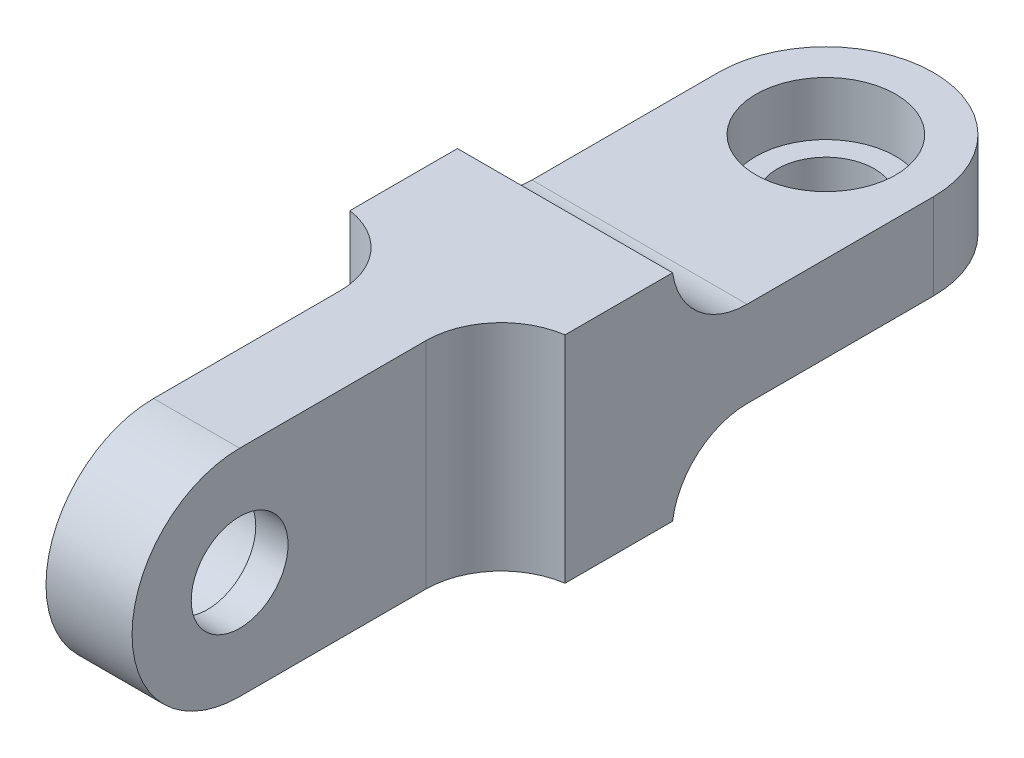
ISO-10303-21;
HEADER;
FILE_DESCRIPTION(('STEP AP214'),'2;1');
FILE_NAME('part.step','',(''),(''),'','','');
FILE_SCHEMA(('AUTOMOTIVE_DESIGN { 1 0 10303 214 1 1 1 1 }'));
ENDSEC;
DATA;
#1=APPLICATION_CONTEXT('core data for automotive mechanical design processes');
#2=APPLICATION_PROTOCOL_DEFINITION('international standard','automotive_design',2000,#1);
#3=PRODUCT_CONTEXT('',#1,'mechanical');
#4=PRODUCT('Part','Part','',(#3));
#5=PRODUCT_RELATED_PRODUCT_CATEGORY('part','',(#4));
#6=PRODUCT_DEFINITION_FORMATION('','',#4);
#7=PRODUCT_DEFINITION_CONTEXT('part definition',#1,'design');
#8=PRODUCT_DEFINITION('design','',#6,#7);
#9=PRODUCT_DEFINITION_SHAPE('','',#8);
#10=(LENGTH_UNIT() NAMED_UNIT(*) SI_UNIT(.MILLI.,.METRE.));
#11=(NAMED_UNIT(*) PLANE_ANGLE_UNIT() SI_UNIT($,.RADIAN.));
#12=(NAMED_UNIT(*) SI_UNIT($,.STERADIAN.) SOLID_ANGLE_UNIT());
#13=UNCERTAINTY_MEASURE_WITH_UNIT(LENGTH_MEASURE(1.E-05),#10,'distance_accuracy_value','');
#14=(GEOMETRIC_REPRESENTATION_CONTEXT(3) GLOBAL_UNCERTAINTY_ASSIGNED_CONTEXT((#13)) GLOBAL_UNIT_ASSIGNED_CONTEXT((#10,
#11,#12)) REPRESENTATION_CONTEXT('',''));
#15=CARTESIAN_POINT('',(0.,0.,0.));
#16=DIRECTION('',(0.,0.,1.));
#17=DIRECTION('',(1.,0.,0.));
#18=AXIS2_PLACEMENT_3D('',#15,#16,#17);
#19=CARTESIAN_POINT('',(10.,10.,80.297387422123));
#20=DIRECTION('',(-1.,0.,0.));
#21=DIRECTION('',(0.,-1.,0.));
#22=AXIS2_PLACEMENT_3D('',#19,#20,#21);
#23=PLANE('',#22);
#24=DIRECTION('',(0.,0.,-1.));
#25=VECTOR('',#24,1.);
#26=CARTESIAN_POINT('',(10.,-10.,80.297387422123));
#27=LINE('',#26,#25);
#28=CARTESIAN_POINT('',(9.99999999999998,-10.,45.1486937110615));
#29=VERTEX_POINT('',#28);
#30=CARTESIAN_POINT('',(10.,-10.,35.1486937110615));
#31=VERTEX_POINT('',#30);
#32=EDGE_CURVE('E226',#29,#31,#27,.T.);
#33=ORIENTED_EDGE('',*,*,#32,.T.);
#34=CARTESIAN_POINT('',(10.,-11.,28.220490480786));
#35=DIRECTION('',(-1.,0.,0.));
#36=DIRECTION('',(0.,-1.,0.));
#37=AXIS2_PLACEMENT_3D('',#34,#35,#36);
#38=CIRCLE('',#37,7.);
#39=CARTESIAN_POINT('',(10.,-4.00000000000001,28.220490480786));
#40=VERTEX_POINT('',#39);
#41=EDGE_CURVE('E78',#31,#40,#38,.T.);
#42=ORIENTED_EDGE('',*,*,#41,.T.);
#43=DIRECTION('',(0.,0.,1.));
#44=VECTOR('',#43,1.);
#45=CARTESIAN_POINT('',(10.,-4.,0.));
#46=LINE('',#45,#44);
#47=CARTESIAN_POINT('',(10.,-4.,10.9027061529883));
#48=VERTEX_POINT('',#47);
#49=EDGE_CURVE('E235',#48,#40,#46,.T.);
#50=ORIENTED_EDGE('',*,*,#49,.F.);
#51=DIRECTION('',(0.,-1.,0.));
#52=VECTOR('',#51,1.);
#53=CARTESIAN_POINT('',(9.99999999999999,25.,10.9027061529883));
#54=LINE('',#53,#52);
#55=CARTESIAN_POINT('',(10.,4.,10.9027061529883));
#56=VERTEX_POINT('',#55);
#57=EDGE_CURVE('E220',#56,#48,#54,.T.);
#58=ORIENTED_EDGE('',*,*,#57,.F.);
#59=DIRECTION('',(0.,0.,-1.));
#60=VECTOR('',#59,1.);
#61=CARTESIAN_POINT('',(10.,4.,0.));
#62=LINE('',#61,#60);
#63=CARTESIAN_POINT('',(10.,4.,28.220490480786));
#64=VERTEX_POINT('',#63);
#65=EDGE_CURVE('E234',#64,#56,#62,.T.);
#66=ORIENTED_EDGE('',*,*,#65,.F.);
#67=CARTESIAN_POINT('',(10.,11.,28.220490480786));
#68=DIRECTION('',(-1.,0.,0.));
#69=DIRECTION('',(0.,-1.,0.));
#70=AXIS2_PLACEMENT_3D('',#67,#68,#69);
#71=CIRCLE('',#70,7.);
#72=CARTESIAN_POINT('',(10.,10.,35.1486937110615));
#73=VERTEX_POINT('',#72);
#74=EDGE_CURVE('E302',#64,#73,#71,.T.);
#75=ORIENTED_EDGE('',*,*,#74,.T.);
#76=DIRECTION('',(0.,0.,-1.));
#77=VECTOR('',#76,1.);
#78=CARTESIAN_POINT('',(10.,10.,80.297387422123));
#79=LINE('',#78,#77);
#80=CARTESIAN_POINT('',(9.99999999999998,10.,45.1486937110615));
#81=VERTEX_POINT('',#80);
#82=EDGE_CURVE('E215',#81,#73,#79,.T.);
#83=ORIENTED_EDGE('',*,*,#82,.F.);
#84=DIRECTION('',(0.,1.,0.));
#85=VECTOR('',#84,1.);
#86=CARTESIAN_POINT('',(9.99999999999998,-10.,45.1486937110615));
#87=LINE('',#86,#85);
#88=EDGE_CURVE('E211',#29,#81,#87,.T.);
#89=ORIENTED_EDGE('',*,*,#88,.F.);
#90=EDGE_LOOP('',(#33,#42,#50,#58,#66,#75,#83,#89));
#91=FACE_BOUND('',#90,.T.);
#92=ADVANCED_FACE('F69',(#91),#23,.F.);
#93=CARTESIAN_POINT('',(-10.,10.,80.297387422123));
#94=DIRECTION('',(1.,0.,0.));
#95=DIRECTION('',(0.,1.,0.));
#96=AXIS2_PLACEMENT_3D('',#93,#94,#95);
#97=PLANE('',#96);
#98=DIRECTION('',(0.,0.,-1.));
#99=VECTOR('',#98,1.);
#100=CARTESIAN_POINT('',(-10.,10.,80.297387422123));
#101=LINE('',#100,#99);
#102=CARTESIAN_POINT('',(-9.99999999999996,10.,45.1486937110615));
#103=VERTEX_POINT('',#102);
#104=CARTESIAN_POINT('',(-10.,10.,35.1486937110615));
#105=VERTEX_POINT('',#104);
#106=EDGE_CURVE('E271',#103,#105,#101,.T.);
#107=ORIENTED_EDGE('',*,*,#106,.T.);
#108=CARTESIAN_POINT('',(-10.,11.,28.220490480786));
#109=DIRECTION('',(1.,0.,0.));
#110=DIRECTION('',(0.,1.,0.));
#111=AXIS2_PLACEMENT_3D('',#108,#109,#110);
#112=CIRCLE('',#111,7.);
#113=CARTESIAN_POINT('',(-10.,3.99999999999999,28.220490480786));
#114=VERTEX_POINT('',#113);
#115=EDGE_CURVE('E305',#105,#114,#112,.T.);
#116=ORIENTED_EDGE('',*,*,#115,.T.);
#117=DIRECTION('',(0.,0.,-1.));
#118=VECTOR('',#117,1.);
#119=CARTESIAN_POINT('',(-10.,3.99999999999999,80.297387422123));
#120=LINE('',#119,#118);
#121=CARTESIAN_POINT('',(-10.,4.,10.9027061529883));
#122=VERTEX_POINT('',#121);
#123=EDGE_CURVE('E225',#114,#122,#120,.T.);
#124=ORIENTED_EDGE('',*,*,#123,.T.);
#125=DIRECTION('',(0.,-1.,0.));
#126=VECTOR('',#125,1.);
#127=CARTESIAN_POINT('',(-10.,25.,10.9027061529883));
#128=LINE('',#127,#126);
#129=CARTESIAN_POINT('',(-10.,-4.,10.9027061529883));
#130=VERTEX_POINT('',#129);
#131=EDGE_CURVE('E256',#122,#130,#128,.T.);
#132=ORIENTED_EDGE('',*,*,#131,.T.);
#133=DIRECTION('',(0.,0.,1.));
#134=VECTOR('',#133,1.);
#135=CARTESIAN_POINT('',(-10.,-4.00000000000001,80.297387422123));
#136=LINE('',#135,#134);
#137=CARTESIAN_POINT('',(-10.,-4.00000000000001,28.220490480786));
#138=VERTEX_POINT('',#137);
#139=EDGE_CURVE('E222',#130,#138,#136,.T.);
#140=ORIENTED_EDGE('',*,*,#139,.T.);
#141=CARTESIAN_POINT('',(-10.,-11.,28.220490480786));
#142=DIRECTION('',(1.,0.,0.));
#143=DIRECTION('',(0.,1.,0.));
#144=AXIS2_PLACEMENT_3D('',#141,#142,#143);
#145=CIRCLE('',#144,7.);
#146=CARTESIAN_POINT('',(-10.,-10.,35.1486937110615));
#147=VERTEX_POINT('',#146);
#148=EDGE_CURVE('E13',#138,#147,#145,.T.);
#149=ORIENTED_EDGE('',*,*,#148,.T.);
#150=DIRECTION('',(0.,0.,-1.));
#151=VECTOR('',#150,1.);
#152=CARTESIAN_POINT('',(-10.,-10.,80.297387422123));
#153=LINE('',#152,#151);
#154=CARTESIAN_POINT('',(-9.99999999999996,-10.,45.1486937110615));
#155=VERTEX_POINT('',#154);
#156=EDGE_CURVE('E274',#155,#147,#153,.T.);
#157=ORIENTED_EDGE('',*,*,#156,.F.);
#158=DIRECTION('',(0.,-1.,0.));
#159=VECTOR('',#158,1.);
#160=CARTESIAN_POINT('',(-9.99999999999996,-10.,45.1486937110615));
#161=LINE('',#160,#159);
#162=EDGE_CURVE('E202',#103,#155,#161,.T.);
#163=ORIENTED_EDGE('',*,*,#162,.F.);
#164=EDGE_LOOP('',(#107,#116,#124,#132,#140,#149,#157,#163));
#165=FACE_BOUND('',#164,.T.);
#166=ADVANCED_FACE('F311',(#165),#97,.F.);
#167=CARTESIAN_POINT('',(-10.,10.,80.297387422123));
#168=DIRECTION('',(0.,-1.,0.));
#169=DIRECTION('',(1.,0.,0.));
#170=AXIS2_PLACEMENT_3D('',#167,#168,#169);
#171=PLANE('',#170);
#172=ORIENTED_EDGE('',*,*,#82,.T.);
#173=DIRECTION('',(1.,0.,0.));
#174=VECTOR('',#173,1.);
#175=CARTESIAN_POINT('',(-24.,10.,35.1486937110615));
#176=LINE('',#175,#174);
#177=EDGE_CURVE('E230',#105,#73,#176,.T.);
#178=ORIENTED_EDGE('',*,*,#177,.F.);
#179=ORIENTED_EDGE('',*,*,#106,.F.);
#180=CARTESIAN_POINT('',(-11.,10.,52.076896941337));
#181=DIRECTION('',(0.,-1.,0.));
#182=DIRECTION('',(1.,0.,0.));
#183=AXIS2_PLACEMENT_3D('',#180,#181,#182);
#184=CIRCLE('',#183,7.);
#185=CARTESIAN_POINT('',(-4.00000000000003,9.99999999999999,52.076896941337));
#186=VERTEX_POINT('',#185);
#187=EDGE_CURVE('E290',#103,#186,#184,.T.);
#188=ORIENTED_EDGE('',*,*,#187,.T.);
#189=DIRECTION('',(0.,0.,1.));
#190=VECTOR('',#189,1.);
#191=CARTESIAN_POINT('',(-4.00000000000003,9.99999999999999,80.297387422123));
#192=LINE('',#191,#190);
#193=CARTESIAN_POINT('',(-4.00000000000003,9.99999999999998,69.3946812691347));
#194=VERTEX_POINT('',#193);
#195=EDGE_CURVE('E180',#186,#194,#192,.T.);
#196=ORIENTED_EDGE('',*,*,#195,.T.);
#197=DIRECTION('',(1.,0.,0.));
#198=VECTOR('',#197,1.);
#199=CARTESIAN_POINT('',(-25.,9.99999999999991,69.3946812691347));
#200=LINE('',#199,#198);
#201=CARTESIAN_POINT('',(3.99999999999997,10.,69.3946812691347));
#202=VERTEX_POINT('',#201);
#203=EDGE_CURVE('E163',#194,#202,#200,.T.);
#204=ORIENTED_EDGE('',*,*,#203,.T.);
#205=DIRECTION('',(0.,0.,-1.));
#206=VECTOR('',#205,1.);
#207=CARTESIAN_POINT('',(3.99999999999997,10.,80.297387422123));
#208=LINE('',#207,#206);
#209=CARTESIAN_POINT('',(3.99999999999997,10.,52.076896941337));
#210=VERTEX_POINT('',#209);
#211=EDGE_CURVE('E178',#202,#210,#208,.T.);
#212=ORIENTED_EDGE('',*,*,#211,.T.);
#213=CARTESIAN_POINT('',(11.,10.,52.076896941337));
#214=DIRECTION('',(0.,-1.,0.));
#215=DIRECTION('',(1.,0.,0.));
#216=AXIS2_PLACEMENT_3D('',#213,#214,#215);
#217=CIRCLE('',#216,7.);
#218=EDGE_CURVE('E296',#210,#81,#217,.T.);
#219=ORIENTED_EDGE('',*,*,#218,.T.);
#220=EDGE_LOOP('',(#172,#178,#179,#188,#196,#204,#212,#219));
#221=FACE_BOUND('',#220,.T.);
#222=ADVANCED_FACE('F177',(#221),#171,.F.);
#223=CARTESIAN_POINT('',(-10.,-10.,80.297387422123));
#224=DIRECTION('',(0.,1.,0.));
#225=DIRECTION('',(0.,0.,1.));
#226=AXIS2_PLACEMENT_3D('',#223,#224,#225);
#227=PLANE('',#226);
#228=ORIENTED_EDGE('',*,*,#156,.T.);
#229=DIRECTION('',(1.,0.,0.));
#230=VECTOR('',#229,1.);
#231=CARTESIAN_POINT('',(-24.,-10.,35.1486937110615));
#232=LINE('',#231,#230);
#233=EDGE_CURVE('E229',#147,#31,#232,.T.);
#234=ORIENTED_EDGE('',*,*,#233,.T.);
#235=ORIENTED_EDGE('',*,*,#32,.F.);
#236=CARTESIAN_POINT('',(11.,-10.,52.076896941337));
#237=DIRECTION('',(0.,1.,0.));
#238=DIRECTION('',(0.,0.,1.));
#239=AXIS2_PLACEMENT_3D('',#236,#237,#238);
#240=CIRCLE('',#239,7.);
#241=CARTESIAN_POINT('',(4.00000000000004,-9.99999999999998,52.076896941337));
#242=VERTEX_POINT('',#241);
#243=EDGE_CURVE('E299',#29,#242,#240,.T.);
#244=ORIENTED_EDGE('',*,*,#243,.T.);
#245=DIRECTION('',(0.,0.,-1.));
#246=VECTOR('',#245,1.);
#247=CARTESIAN_POINT('',(4.00000000000004,-9.99999999999998,80.297387422123));
#248=LINE('',#247,#246);
#249=CARTESIAN_POINT('',(4.00000000000004,-9.99999999999998,69.3946812691347));
#250=VERTEX_POINT('',#249);
#251=EDGE_CURVE('E192',#250,#242,#248,.T.);
#252=ORIENTED_EDGE('',*,*,#251,.F.);
#253=DIRECTION('',(1.,0.,0.));
#254=VECTOR('',#253,1.);
#255=CARTESIAN_POINT('',(-25.,-10.0000000000001,69.3946812691347));
#256=LINE('',#255,#254);
#257=CARTESIAN_POINT('',(-3.99999999999997,-10.,69.3946812691347));
#258=VERTEX_POINT('',#257);
#259=EDGE_CURVE('E166',#258,#250,#256,.T.);
#260=ORIENTED_EDGE('',*,*,#259,.F.);
#261=DIRECTION('',(0.,0.,1.));
#262=VECTOR('',#261,1.);
#263=CARTESIAN_POINT('',(-3.99999999999996,-10.,80.297387422123));
#264=LINE('',#263,#262);
#265=CARTESIAN_POINT('',(-3.99999999999996,-10.,52.076896941337));
#266=VERTEX_POINT('',#265);
#267=EDGE_CURVE('E188',#266,#258,#264,.T.);
#268=ORIENTED_EDGE('',*,*,#267,.F.);
#269=CARTESIAN_POINT('',(-11.,-10.,52.076896941337));
#270=DIRECTION('',(0.,1.,0.));
#271=DIRECTION('',(0.,0.,1.));
#272=AXIS2_PLACEMENT_3D('',#269,#270,#271);
#273=CIRCLE('',#272,7.);
#274=EDGE_CURVE('E293',#266,#155,#273,.T.);
#275=ORIENTED_EDGE('',*,*,#274,.T.);
#276=EDGE_LOOP('',(#228,#234,#235,#244,#252,#260,#268,#275));
#277=FACE_BOUND('',#276,.T.);
#278=ADVANCED_FACE('F331',(#277),#227,.F.);
#279=CARTESIAN_POINT('',(-24.,4.,0.));
#280=DIRECTION('',(0.,-1.,0.));
#281=DIRECTION('',(0.,0.,-1.));
#282=AXIS2_PLACEMENT_3D('',#279,#280,#281);
#283=PLANE('',#282);
#284=CARTESIAN_POINT('',(0.,4.,10.9027061529883));
#285=DIRECTION('',(0.,-1.,0.));
#286=DIRECTION('',(0.,0.,-1.));
#287=AXIS2_PLACEMENT_3D('',#284,#285,#286);
#288=CIRCLE('',#287,6.5);
#289=CARTESIAN_POINT('',(0.,4.,4.40270615298831));
#290=VERTEX_POINT('',#289);
#291=EDGE_CURVE('E244',#290,#290,#288,.T.);
#292=ORIENTED_EDGE('',*,*,#291,.T.);
#293=EDGE_LOOP('',(#292));
#294=FACE_BOUND('',#293,.T.);
#295=ORIENTED_EDGE('',*,*,#123,.F.);
#296=DIRECTION('',(1.,0.,0.));
#297=VECTOR('',#296,1.);
#298=CARTESIAN_POINT('',(-24.,3.99999999999999,28.220490480786));
#299=LINE('',#298,#297);
#300=EDGE_CURVE('E284',#114,#64,#299,.T.);
#301=ORIENTED_EDGE('',*,*,#300,.T.);
#302=ORIENTED_EDGE('',*,*,#65,.T.);
#303=CARTESIAN_POINT('',(0.,4.,10.9027061529883));
#304=DIRECTION('',(0.,-1.,0.));
#305=DIRECTION('',(0.,0.,-1.));
#306=AXIS2_PLACEMENT_3D('',#303,#304,#305);
#307=CIRCLE('',#306,10.);
#308=EDGE_CURVE('E221',#122,#56,#307,.T.);
#309=ORIENTED_EDGE('',*,*,#308,.F.);
#310=EDGE_LOOP('',(#295,#301,#302,#309));
#311=FACE_BOUND('',#310,.T.);
#312=ADVANCED_FACE('F320',(#294,#311),#283,.F.);
#313=CARTESIAN_POINT('',(-24.,-4.,0.));
#314=DIRECTION('',(0.,1.,0.));
#315=DIRECTION('',(0.,0.,1.));
#316=AXIS2_PLACEMENT_3D('',#313,#314,#315);
#317=PLANE('',#316);
#318=CARTESIAN_POINT('',(0.,-4.,10.9027061529883));
#319=DIRECTION('',(0.,-1.,0.));
#320=DIRECTION('',(0.,0.,-1.));
#321=AXIS2_PLACEMENT_3D('',#318,#319,#320);
#322=CIRCLE('',#321,4.5);
#323=CARTESIAN_POINT('',(0.,-4.,6.40270615298831));
#324=VERTEX_POINT('',#323);
#325=EDGE_CURVE('E264',#324,#324,#322,.T.);
#326=ORIENTED_EDGE('',*,*,#325,.F.);
#327=EDGE_LOOP('',(#326));
#328=FACE_BOUND('',#327,.T.);
#329=ORIENTED_EDGE('',*,*,#49,.T.);
#330=DIRECTION('',(-1.,0.,0.));
#331=VECTOR('',#330,1.);
#332=CARTESIAN_POINT('',(-24.,-4.00000000000001,28.220490480786));
#333=LINE('',#332,#331);
#334=EDGE_CURVE('E85',#40,#138,#333,.T.);
#335=ORIENTED_EDGE('',*,*,#334,.T.);
#336=ORIENTED_EDGE('',*,*,#139,.F.);
#337=CARTESIAN_POINT('',(0.,-4.,10.9027061529883));
#338=DIRECTION('',(0.,-1.,0.));
#339=DIRECTION('',(0.,0.,-1.));
#340=AXIS2_PLACEMENT_3D('',#337,#338,#339);
#341=CIRCLE('',#340,10.);
#342=EDGE_CURVE('E260',#130,#48,#341,.T.);
#343=ORIENTED_EDGE('',*,*,#342,.T.);
#344=EDGE_LOOP('',(#329,#335,#336,#343));
#345=FACE_BOUND('',#344,.T.);
#346=ADVANCED_FACE('F335',(#328,#345),#317,.F.);
#347=CARTESIAN_POINT('',(0.,-1.,10.9027061529883));
#348=DIRECTION('',(0.,1.,0.));
#349=DIRECTION('',(0.,0.,1.));
#350=AXIS2_PLACEMENT_3D('',#347,#348,#349);
#351=CYLINDRICAL_SURFACE('',#350,6.5);
#352=CARTESIAN_POINT('',(0.,-1.,10.9027061529883));
#353=DIRECTION('',(0.,-1.,0.));
#354=DIRECTION('',(0.,0.,-1.));
#355=AXIS2_PLACEMENT_3D('',#352,#353,#354);
#356=CIRCLE('',#355,6.5);
#357=CARTESIAN_POINT('',(0.,-1.,4.40270615298831));
#358=VERTEX_POINT('',#357);
#359=EDGE_CURVE('E238',#358,#358,#356,.T.);
#360=ORIENTED_EDGE('',*,*,#359,.T.);
#361=EDGE_LOOP('',(#360));
#362=FACE_BOUND('',#361,.T.);
#363=ORIENTED_EDGE('',*,*,#291,.F.);
#364=EDGE_LOOP('',(#363));
#365=FACE_BOUND('',#364,.T.);
#366=ADVANCED_FACE('F424',(#362,#365),#351,.F.);
#367=CARTESIAN_POINT('',(0.,-1.,10.9027061529883));
#368=DIRECTION('',(0.,-1.,0.));
#369=DIRECTION('',(0.,0.,-1.));
#370=AXIS2_PLACEMENT_3D('',#367,#368,#369);
#371=PLANE('',#370);
#372=CARTESIAN_POINT('',(0.,-1.,10.9027061529883));
#373=DIRECTION('',(0.,-1.,0.));
#374=DIRECTION('',(0.,0.,-1.));
#375=AXIS2_PLACEMENT_3D('',#372,#373,#374);
#376=CIRCLE('',#375,4.5);
#377=CARTESIAN_POINT('',(0.,-1.,6.40270615298831));
#378=VERTEX_POINT('',#377);
#379=EDGE_CURVE('E216',#378,#378,#376,.T.);
#380=ORIENTED_EDGE('',*,*,#379,.T.);
#381=EDGE_LOOP('',(#380));
#382=FACE_BOUND('',#381,.T.);
#383=ORIENTED_EDGE('',*,*,#359,.F.);
#384=EDGE_LOOP('',(#383));
#385=FACE_BOUND('',#384,.T.);
#386=ADVANCED_FACE('F351',(#382,#385),#371,.F.);
#387=CARTESIAN_POINT('',(0.,25.,10.9027061529883));
#388=DIRECTION('',(0.,-1.,0.));
#389=DIRECTION('',(0.,0.,-1.));
#390=AXIS2_PLACEMENT_3D('',#387,#388,#389);
#391=CYLINDRICAL_SURFACE('',#390,4.5);
#392=ORIENTED_EDGE('',*,*,#325,.T.);
#393=EDGE_LOOP('',(#392));
#394=FACE_BOUND('',#393,.T.);
#395=ORIENTED_EDGE('',*,*,#379,.F.);
#396=EDGE_LOOP('',(#395));
#397=FACE_BOUND('',#396,.T.);
#398=ADVANCED_FACE('F340',(#394,#397),#391,.F.);
#399=CARTESIAN_POINT('',(0.,25.,10.9027061529883));
#400=DIRECTION('',(0.,-1.,0.));
#401=DIRECTION('',(0.,0.,-1.));
#402=AXIS2_PLACEMENT_3D('',#399,#400,#401);
#403=CYLINDRICAL_SURFACE('',#402,10.);
#404=ORIENTED_EDGE('',*,*,#308,.T.);
#405=ORIENTED_EDGE('',*,*,#57,.T.);
#406=ORIENTED_EDGE('',*,*,#342,.F.);
#407=ORIENTED_EDGE('',*,*,#131,.F.);
#408=EDGE_LOOP('',(#404,#405,#406,#407));
#409=FACE_BOUND('',#408,.T.);
#410=ADVANCED_FACE('F337',(#409),#403,.T.);
#411=CARTESIAN_POINT('',(1.,0.,69.3946812691347));
#412=DIRECTION('',(1.,0.,0.));
#413=DIRECTION('',(0.,0.,1.));
#414=AXIS2_PLACEMENT_3D('',#411,#412,#413);
#415=PLANE('',#414);
#416=CARTESIAN_POINT('',(1.,0.,69.3946812691347));
#417=DIRECTION('',(1.,0.,0.));
#418=DIRECTION('',(0.,0.,-1.));
#419=AXIS2_PLACEMENT_3D('',#416,#417,#418);
#420=CIRCLE('',#419,4.5);
#421=CARTESIAN_POINT('',(1.,0.,64.8946812691347));
#422=VERTEX_POINT('',#421);
#423=EDGE_CURVE('E203',#422,#422,#420,.F.);
#424=ORIENTED_EDGE('',*,*,#423,.F.);
#425=EDGE_LOOP('',(#424));
#426=FACE_BOUND('',#425,.T.);
#427=CARTESIAN_POINT('',(1.,0.,69.3946812691347));
#428=DIRECTION('',(-1.,0.,0.));
#429=DIRECTION('',(0.,0.,1.));
#430=AXIS2_PLACEMENT_3D('',#427,#428,#429);
#431=CIRCLE('',#430,6.5);
#432=CARTESIAN_POINT('',(1.,0.,75.8946812691347));
#433=VERTEX_POINT('',#432);
#434=EDGE_CURVE('E194',#433,#433,#431,.T.);
#435=ORIENTED_EDGE('',*,*,#434,.T.);
#436=EDGE_LOOP('',(#435));
#437=FACE_BOUND('',#436,.T.);
#438=ADVANCED_FACE('F339',(#426,#437),#415,.F.);
#439=CARTESIAN_POINT('',(1.,0.,69.3946812691347));
#440=DIRECTION('',(-1.,0.,0.));
#441=DIRECTION('',(0.,0.,1.));
#442=AXIS2_PLACEMENT_3D('',#439,#440,#441);
#443=CYLINDRICAL_SURFACE('',#442,6.5);
#444=ORIENTED_EDGE('',*,*,#434,.F.);
#445=EDGE_LOOP('',(#444));
#446=FACE_BOUND('',#445,.T.);
#447=CARTESIAN_POINT('',(-4.,0.,69.3946812691347));
#448=DIRECTION('',(-1.,0.,0.));
#449=DIRECTION('',(0.,0.,1.));
#450=AXIS2_PLACEMENT_3D('',#447,#448,#449);
#451=CIRCLE('',#450,6.5);
#452=CARTESIAN_POINT('',(-4.,0.,75.8946812691347));
#453=VERTEX_POINT('',#452);
#454=EDGE_CURVE('E197',#453,#453,#451,.T.);
#455=ORIENTED_EDGE('',*,*,#454,.T.);
#456=EDGE_LOOP('',(#455));
#457=FACE_BOUND('',#456,.T.);
#458=ADVANCED_FACE('F347',(#446,#457),#443,.F.);
#459=CARTESIAN_POINT('',(-25.,0.,69.3946812691347));
#460=DIRECTION('',(1.,0.,0.));
#461=DIRECTION('',(0.,0.,-1.));
#462=AXIS2_PLACEMENT_3D('',#459,#460,#461);
#463=CYLINDRICAL_SURFACE('',#462,4.5);
#464=CARTESIAN_POINT('',(4.,0.,69.3946812691347));
#465=DIRECTION('',(-1.,0.,0.));
#466=DIRECTION('',(0.,0.,1.));
#467=AXIS2_PLACEMENT_3D('',#464,#465,#466);
#468=CIRCLE('',#467,4.5);
#469=CARTESIAN_POINT('',(4.,0.,73.8946812691347));
#470=VERTEX_POINT('',#469);
#471=EDGE_CURVE('E172',#470,#470,#468,.T.);
#472=ORIENTED_EDGE('',*,*,#471,.F.);
#473=EDGE_LOOP('',(#472));
#474=FACE_BOUND('',#473,.T.);
#475=ORIENTED_EDGE('',*,*,#423,.T.);
#476=EDGE_LOOP('',(#475));
#477=FACE_BOUND('',#476,.T.);
#478=ADVANCED_FACE('F414',(#474,#477),#463,.F.);
#479=CARTESIAN_POINT('',(-3.99999999999991,-24.,80.297387422123));
#480=DIRECTION('',(-1.,0.,0.));
#481=DIRECTION('',(0.,0.,1.));
#482=AXIS2_PLACEMENT_3D('',#479,#480,#481);
#483=PLANE('',#482);
#484=ORIENTED_EDGE('',*,*,#454,.F.);
#485=EDGE_LOOP('',(#484));
#486=FACE_BOUND('',#485,.T.);
#487=ORIENTED_EDGE('',*,*,#195,.F.);
#488=DIRECTION('',(0.,1.,0.));
#489=VECTOR('',#488,1.);
#490=CARTESIAN_POINT('',(-3.99999999999996,-10.,52.076896941337));
#491=LINE('',#490,#489);
#492=EDGE_CURVE('E268',#186,#266,#491,.F.);
#493=ORIENTED_EDGE('',*,*,#492,.T.);
#494=ORIENTED_EDGE('',*,*,#267,.T.);
#495=CARTESIAN_POINT('',(-4.,0.,69.3946812691347));
#496=DIRECTION('',(-1.,0.,0.));
#497=DIRECTION('',(0.,0.,1.));
#498=AXIS2_PLACEMENT_3D('',#495,#496,#497);
#499=CIRCLE('',#498,10.);
#500=EDGE_CURVE('E207',#194,#258,#499,.F.);
#501=ORIENTED_EDGE('',*,*,#500,.F.);
#502=EDGE_LOOP('',(#487,#493,#494,#501));
#503=FACE_BOUND('',#502,.T.);
#504=ADVANCED_FACE('F410',(#486,#503),#483,.T.);
#505=CARTESIAN_POINT('',(-25.,0.,69.3946812691347));
#506=DIRECTION('',(1.,0.,0.));
#507=DIRECTION('',(0.,0.,-1.));
#508=AXIS2_PLACEMENT_3D('',#505,#506,#507);
#509=CYLINDRICAL_SURFACE('',#508,10.);
#510=ORIENTED_EDGE('',*,*,#500,.T.);
#511=ORIENTED_EDGE('',*,*,#259,.T.);
#512=CARTESIAN_POINT('',(4.,0.,69.3946812691347));
#513=DIRECTION('',(-1.,0.,0.));
#514=DIRECTION('',(0.,0.,1.));
#515=AXIS2_PLACEMENT_3D('',#512,#513,#514);
#516=CIRCLE('',#515,10.);
#517=EDGE_CURVE('E159',#250,#202,#516,.T.);
#518=ORIENTED_EDGE('',*,*,#517,.T.);
#519=ORIENTED_EDGE('',*,*,#203,.F.);
#520=EDGE_LOOP('',(#510,#511,#518,#519));
#521=FACE_BOUND('',#520,.T.);
#522=ADVANCED_FACE('F162',(#521),#509,.T.);
#523=CARTESIAN_POINT('',(4.00000000000009,-24.,80.297387422123));
#524=DIRECTION('',(1.,0.,0.));
#525=DIRECTION('',(0.,0.,-1.));
#526=AXIS2_PLACEMENT_3D('',#523,#524,#525);
#527=PLANE('',#526);
#528=ORIENTED_EDGE('',*,*,#471,.T.);
#529=EDGE_LOOP('',(#528));
#530=FACE_BOUND('',#529,.T.);
#531=ORIENTED_EDGE('',*,*,#251,.T.);
#532=DIRECTION('',(0.,-1.,0.));
#533=VECTOR('',#532,1.);
#534=CARTESIAN_POINT('',(3.99999999999997,10.,52.076896941337));
#535=LINE('',#534,#533);
#536=EDGE_CURVE('E186',#242,#210,#535,.F.);
#537=ORIENTED_EDGE('',*,*,#536,.T.);
#538=ORIENTED_EDGE('',*,*,#211,.F.);
#539=ORIENTED_EDGE('',*,*,#517,.F.);
#540=EDGE_LOOP('',(#531,#537,#538,#539));
#541=FACE_BOUND('',#540,.T.);
#542=ADVANCED_FACE('F184',(#530,#541),#527,.T.);
#543=CARTESIAN_POINT('',(-11.,0.,52.076896941337));
#544=DIRECTION('',(0.,-1.,0.));
#545=DIRECTION('',(1.,0.,0.));
#546=AXIS2_PLACEMENT_3D('',#543,#544,#545);
#547=CYLINDRICAL_SURFACE('',#546,7.);
#548=ORIENTED_EDGE('',*,*,#274,.F.);
#549=ORIENTED_EDGE('',*,*,#492,.F.);
#550=ORIENTED_EDGE('',*,*,#187,.F.);
#551=ORIENTED_EDGE('',*,*,#162,.T.);
#552=EDGE_LOOP('',(#548,#549,#550,#551));
#553=FACE_BOUND('',#552,.T.);
#554=ADVANCED_FACE('F350',(#553),#547,.F.);
#555=CARTESIAN_POINT('',(11.,0.,52.076896941337));
#556=DIRECTION('',(0.,1.,0.));
#557=DIRECTION('',(-1.,0.,0.));
#558=AXIS2_PLACEMENT_3D('',#555,#556,#557);
#559=CYLINDRICAL_SURFACE('',#558,7.);
#560=ORIENTED_EDGE('',*,*,#243,.F.);
#561=ORIENTED_EDGE('',*,*,#88,.T.);
#562=ORIENTED_EDGE('',*,*,#218,.F.);
#563=ORIENTED_EDGE('',*,*,#536,.F.);
#564=EDGE_LOOP('',(#560,#561,#562,#563));
#565=FACE_BOUND('',#564,.T.);
#566=ADVANCED_FACE('F328',(#565),#559,.F.);
#567=CARTESIAN_POINT('',(-24.,11.,28.220490480786));
#568=DIRECTION('',(1.,0.,0.));
#569=DIRECTION('',(0.,1.,0.));
#570=AXIS2_PLACEMENT_3D('',#567,#568,#569);
#571=CYLINDRICAL_SURFACE('',#570,7.);
#572=ORIENTED_EDGE('',*,*,#115,.F.);
#573=ORIENTED_EDGE('',*,*,#177,.T.);
#574=ORIENTED_EDGE('',*,*,#74,.F.);
#575=ORIENTED_EDGE('',*,*,#300,.F.);
#576=EDGE_LOOP('',(#572,#573,#574,#575));
#577=FACE_BOUND('',#576,.T.);
#578=ADVANCED_FACE('F322',(#577),#571,.F.);
#579=CARTESIAN_POINT('',(-24.,-11.,28.220490480786));
#580=DIRECTION('',(-1.,0.,0.));
#581=DIRECTION('',(0.,0.,1.));
#582=AXIS2_PLACEMENT_3D('',#579,#580,#581);
#583=CYLINDRICAL_SURFACE('',#582,7.);
#584=ORIENTED_EDGE('',*,*,#148,.F.);
#585=ORIENTED_EDGE('',*,*,#334,.F.);
#586=ORIENTED_EDGE('',*,*,#41,.F.);
#587=ORIENTED_EDGE('',*,*,#233,.F.);
#588=EDGE_LOOP('',(#584,#585,#586,#587));
#589=FACE_BOUND('',#588,.T.);
#590=ADVANCED_FACE('F71',(#589),#583,.F.);
#591=CLOSED_SHELL('',(#92,#166,#222,#278,#312,#346,#366,#386,#398,#410,#438,#458,#478,#504,#522,
#542,#554,#566,#578,#590));
#592=MANIFOLD_SOLID_BREP('B2',#591);
#593=ADVANCED_BREP_SHAPE_REPRESENTATION('',(#18,#592),#14);
#594=SHAPE_DEFINITION_REPRESENTATION(#9,#593);
ENDSEC;
END-ISO-10303-21;
